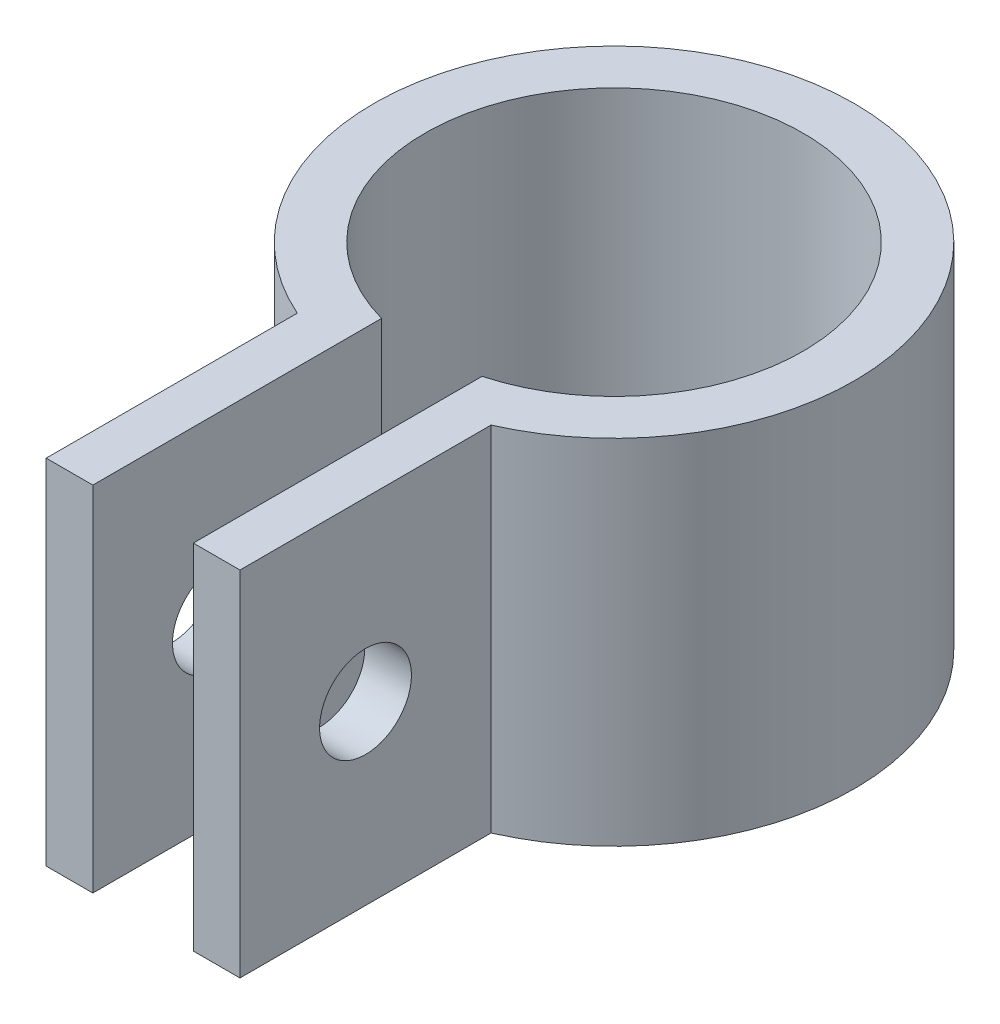
ISO-10303-21;
HEADER;
FILE_DESCRIPTION(('STEP AP214'),'2;1');
FILE_NAME('part.step','',(''),(''),'','','');
FILE_SCHEMA(('AUTOMOTIVE_DESIGN { 1 0 10303 214 1 1 1 1 }'));
ENDSEC;
DATA;
#1=APPLICATION_CONTEXT('core data for automotive mechanical design processes');
#2=APPLICATION_PROTOCOL_DEFINITION('international standard','automotive_design',2000,#1);
#3=PRODUCT_CONTEXT('',#1,'mechanical');
#4=PRODUCT('Part','Part','',(#3));
#5=PRODUCT_RELATED_PRODUCT_CATEGORY('part','',(#4));
#6=PRODUCT_DEFINITION_FORMATION('','',#4);
#7=PRODUCT_DEFINITION_CONTEXT('part definition',#1,'design');
#8=PRODUCT_DEFINITION('design','',#6,#7);
#9=PRODUCT_DEFINITION_SHAPE('','',#8);
#10=(LENGTH_UNIT() NAMED_UNIT(*) SI_UNIT(.MILLI.,.METRE.));
#11=(NAMED_UNIT(*) PLANE_ANGLE_UNIT() SI_UNIT($,.RADIAN.));
#12=(NAMED_UNIT(*) SI_UNIT($,.STERADIAN.) SOLID_ANGLE_UNIT());
#13=UNCERTAINTY_MEASURE_WITH_UNIT(LENGTH_MEASURE(1.E-05),#10,'distance_accuracy_value','');
#14=(GEOMETRIC_REPRESENTATION_CONTEXT(3) GLOBAL_UNCERTAINTY_ASSIGNED_CONTEXT((#13)) GLOBAL_UNIT_ASSIGNED_CONTEXT((#10,
#11,#12)) REPRESENTATION_CONTEXT('',''));
#15=CARTESIAN_POINT('',(0.,0.,0.));
#16=DIRECTION('',(0.,0.,1.));
#17=DIRECTION('',(1.,0.,0.));
#18=AXIS2_PLACEMENT_3D('',#15,#16,#17);
#19=CARTESIAN_POINT('',(0.,10.,0.));
#20=DIRECTION('',(0.,1.,0.));
#21=DIRECTION('',(0.,0.,1.));
#22=AXIS2_PLACEMENT_3D('',#19,#20,#21);
#23=PLANE('',#22);
#24=CARTESIAN_POINT('',(0.,10.,0.));
#25=DIRECTION('',(0.,1.,0.));
#26=DIRECTION('',(0.,0.,1.));
#27=AXIS2_PLACEMENT_3D('',#24,#25,#26);
#28=CIRCLE('',#27,5.35);
#29=CARTESIAN_POINT('',(1.42201100885586,10.,5.15755607731925));
#30=VERTEX_POINT('',#29);
#31=CARTESIAN_POINT('',(-1.42201100885586,10.,5.15755607731925));
#32=VERTEX_POINT('',#31);
#33=EDGE_CURVE('E115',#30,#32,#28,.T.);
#34=ORIENTED_EDGE('',*,*,#33,.F.);
#35=DIRECTION('',(0.,0.,-1.));
#36=VECTOR('',#35,1.);
#37=CARTESIAN_POINT('',(1.42201100885586,10.,22.114209441701));
#38=LINE('',#37,#36);
#39=CARTESIAN_POINT('',(1.42201100885586,10.,13.3292135527086));
#40=VERTEX_POINT('',#39);
#41=EDGE_CURVE('E50',#40,#30,#38,.T.);
#42=ORIENTED_EDGE('',*,*,#41,.F.);
#43=DIRECTION('',(1.,0.,0.));
#44=VECTOR('',#43,1.);
#45=CARTESIAN_POINT('',(2.74228688903122,10.,13.3292135527086));
#46=LINE('',#45,#44);
#47=CARTESIAN_POINT('',(2.74228688903122,10.,13.3292135527086));
#48=VERTEX_POINT('',#47);
#49=EDGE_CURVE('E114',#40,#48,#46,.T.);
#50=ORIENTED_EDGE('',*,*,#49,.T.);
#51=DIRECTION('',(0.,0.,-1.));
#52=VECTOR('',#51,1.);
#53=CARTESIAN_POINT('',(2.74228688903122,10.,-0.0450481591371954));
#54=LINE('',#53,#52);
#55=CARTESIAN_POINT('',(2.74228688903122,10.,6.22252863538991));
#56=VERTEX_POINT('',#55);
#57=EDGE_CURVE('E135',#48,#56,#54,.T.);
#58=ORIENTED_EDGE('',*,*,#57,.T.);
#59=CARTESIAN_POINT('',(0.,10.,0.));
#60=DIRECTION('',(0.,1.,0.));
#61=DIRECTION('',(0.,0.,1.));
#62=AXIS2_PLACEMENT_3D('',#59,#60,#61);
#63=CIRCLE('',#62,6.8);
#64=CARTESIAN_POINT('',(-2.74228688903122,10.,6.22252863538991));
#65=VERTEX_POINT('',#64);
#66=EDGE_CURVE('E145',#56,#65,#63,.T.);
#67=ORIENTED_EDGE('',*,*,#66,.T.);
#68=DIRECTION('',(0.,0.,1.));
#69=VECTOR('',#68,1.);
#70=CARTESIAN_POINT('',(-2.74228688903122,10.,-0.0450481591371954));
#71=LINE('',#70,#69);
#72=CARTESIAN_POINT('',(-2.74228688903122,10.,13.3292135527086));
#73=VERTEX_POINT('',#72);
#74=EDGE_CURVE('E131',#65,#73,#71,.T.);
#75=ORIENTED_EDGE('',*,*,#74,.T.);
#76=CARTESIAN_POINT('',(-1.42201100885586,10.,13.3292135527086));
#77=VERTEX_POINT('',#76);
#78=EDGE_CURVE('E159',#73,#77,#46,.T.);
#79=ORIENTED_EDGE('',*,*,#78,.T.);
#80=DIRECTION('',(0.,0.,1.));
#81=VECTOR('',#80,1.);
#82=CARTESIAN_POINT('',(-1.42201100885586,10.,22.114209441701));
#83=LINE('',#82,#81);
#84=EDGE_CURVE('E151',#32,#77,#83,.T.);
#85=ORIENTED_EDGE('',*,*,#84,.F.);
#86=EDGE_LOOP('',(#34,#42,#50,#58,#67,#75,#79,#85));
#87=FACE_BOUND('',#86,.T.);
#88=ADVANCED_FACE('F35',(#87),#23,.T.);
#89=CARTESIAN_POINT('',(0.,0.,0.));
#90=DIRECTION('',(0.,1.,0.));
#91=DIRECTION('',(0.,0.,1.));
#92=AXIS2_PLACEMENT_3D('',#89,#90,#91);
#93=PLANE('',#92);
#94=DIRECTION('',(0.,0.,-1.));
#95=VECTOR('',#94,1.);
#96=CARTESIAN_POINT('',(1.42201100885586,0.,22.114209441701));
#97=LINE('',#96,#95);
#98=CARTESIAN_POINT('',(1.42201100885586,0.,13.3292135527086));
#99=VERTEX_POINT('',#98);
#100=CARTESIAN_POINT('',(1.42201100885586,0.,5.15755607731925));
#101=VERTEX_POINT('',#100);
#102=EDGE_CURVE('E98',#99,#101,#97,.T.);
#103=ORIENTED_EDGE('',*,*,#102,.T.);
#104=CARTESIAN_POINT('',(0.,0.,0.));
#105=DIRECTION('',(0.,1.,0.));
#106=DIRECTION('',(0.,0.,1.));
#107=AXIS2_PLACEMENT_3D('',#104,#105,#106);
#108=CIRCLE('',#107,5.35);
#109=CARTESIAN_POINT('',(-1.42201100885586,0.,5.15755607731925));
#110=VERTEX_POINT('',#109);
#111=EDGE_CURVE('E126',#101,#110,#108,.T.);
#112=ORIENTED_EDGE('',*,*,#111,.T.);
#113=DIRECTION('',(0.,0.,1.));
#114=VECTOR('',#113,1.);
#115=CARTESIAN_POINT('',(-1.42201100885586,0.,22.114209441701));
#116=LINE('',#115,#114);
#117=CARTESIAN_POINT('',(-1.42201100885586,0.,13.3292135527086));
#118=VERTEX_POINT('',#117);
#119=EDGE_CURVE('E58',#110,#118,#116,.T.);
#120=ORIENTED_EDGE('',*,*,#119,.T.);
#121=DIRECTION('',(1.,0.,0.));
#122=VECTOR('',#121,1.);
#123=CARTESIAN_POINT('',(2.74228688903122,0.,13.3292135527086));
#124=LINE('',#123,#122);
#125=CARTESIAN_POINT('',(-2.74228688903122,0.,13.3292135527086));
#126=VERTEX_POINT('',#125);
#127=EDGE_CURVE('E122',#126,#118,#124,.T.);
#128=ORIENTED_EDGE('',*,*,#127,.F.);
#129=DIRECTION('',(0.,0.,1.));
#130=VECTOR('',#129,1.);
#131=CARTESIAN_POINT('',(-2.74228688903122,0.,-0.0450481591371954));
#132=LINE('',#131,#130);
#133=CARTESIAN_POINT('',(-2.74228688903122,0.,6.22252863538991));
#134=VERTEX_POINT('',#133);
#135=EDGE_CURVE('E123',#134,#126,#132,.T.);
#136=ORIENTED_EDGE('',*,*,#135,.F.);
#137=CARTESIAN_POINT('',(0.,0.,0.));
#138=DIRECTION('',(0.,1.,0.));
#139=DIRECTION('',(0.,0.,1.));
#140=AXIS2_PLACEMENT_3D('',#137,#138,#139);
#141=CIRCLE('',#140,6.8);
#142=CARTESIAN_POINT('',(2.74228688903122,0.,6.22252863538991));
#143=VERTEX_POINT('',#142);
#144=EDGE_CURVE('E144',#143,#134,#141,.T.);
#145=ORIENTED_EDGE('',*,*,#144,.F.);
#146=DIRECTION('',(0.,0.,-1.));
#147=VECTOR('',#146,1.);
#148=CARTESIAN_POINT('',(2.74228688903122,0.,-0.0450481591371954));
#149=LINE('',#148,#147);
#150=CARTESIAN_POINT('',(2.74228688903122,0.,13.3292135527086));
#151=VERTEX_POINT('',#150);
#152=EDGE_CURVE('E121',#151,#143,#149,.T.);
#153=ORIENTED_EDGE('',*,*,#152,.F.);
#154=EDGE_CURVE('E112',#99,#151,#124,.T.);
#155=ORIENTED_EDGE('',*,*,#154,.F.);
#156=EDGE_LOOP('',(#103,#112,#120,#128,#136,#145,#153,#155));
#157=FACE_BOUND('',#156,.T.);
#158=ADVANCED_FACE('F119',(#157),#93,.F.);
#159=CARTESIAN_POINT('',(2.74228688903122,10.,13.3292135527086));
#160=DIRECTION('',(0.,0.,-1.));
#161=DIRECTION('',(-1.,0.,0.));
#162=AXIS2_PLACEMENT_3D('',#159,#160,#161);
#163=PLANE('',#162);
#164=DIRECTION('',(0.,1.,0.));
#165=VECTOR('',#164,1.);
#166=CARTESIAN_POINT('',(1.42201100885586,10.,13.3292135527086));
#167=LINE('',#166,#165);
#168=EDGE_CURVE('E101',#99,#40,#167,.T.);
#169=ORIENTED_EDGE('',*,*,#168,.F.);
#170=ORIENTED_EDGE('',*,*,#154,.T.);
#171=DIRECTION('',(0.,-1.,0.));
#172=VECTOR('',#171,1.);
#173=CARTESIAN_POINT('',(2.74228688903122,10.,13.3292135527086));
#174=LINE('',#173,#172);
#175=EDGE_CURVE('E132',#48,#151,#174,.T.);
#176=ORIENTED_EDGE('',*,*,#175,.F.);
#177=ORIENTED_EDGE('',*,*,#49,.F.);
#178=EDGE_LOOP('',(#169,#170,#176,#177));
#179=FACE_BOUND('',#178,.T.);
#180=ADVANCED_FACE('F110',(#179),#163,.F.);
#181=DIRECTION('',(0.,-1.,0.));
#182=VECTOR('',#181,1.);
#183=CARTESIAN_POINT('',(-1.42201100885586,10.,13.3292135527086));
#184=LINE('',#183,#182);
#185=EDGE_CURVE('E116',#77,#118,#184,.T.);
#186=ORIENTED_EDGE('',*,*,#185,.F.);
#187=ORIENTED_EDGE('',*,*,#78,.F.);
#188=DIRECTION('',(0.,-1.,0.));
#189=VECTOR('',#188,1.);
#190=CARTESIAN_POINT('',(-2.74228688903122,10.,13.3292135527086));
#191=LINE('',#190,#189);
#192=EDGE_CURVE('E134',#73,#126,#191,.T.);
#193=ORIENTED_EDGE('',*,*,#192,.T.);
#194=ORIENTED_EDGE('',*,*,#127,.T.);
#195=EDGE_LOOP('',(#186,#187,#193,#194));
#196=FACE_BOUND('',#195,.T.);
#197=ADVANCED_FACE('F179',(#196),#163,.F.);
#198=CARTESIAN_POINT('',(0.,0.,0.));
#199=DIRECTION('',(0.,1.,0.));
#200=DIRECTION('',(0.,0.,1.));
#201=AXIS2_PLACEMENT_3D('',#198,#199,#200);
#202=CYLINDRICAL_SURFACE('',#201,5.35);
#203=DIRECTION('',(0.,1.,0.));
#204=VECTOR('',#203,1.);
#205=CARTESIAN_POINT('',(1.42201100885586,0.,5.15755607731925));
#206=LINE('',#205,#204);
#207=EDGE_CURVE('E11',#30,#101,#206,.F.);
#208=ORIENTED_EDGE('',*,*,#207,.F.);
#209=ORIENTED_EDGE('',*,*,#33,.T.);
#210=DIRECTION('',(0.,1.,0.));
#211=VECTOR('',#210,1.);
#212=CARTESIAN_POINT('',(-1.42201100885586,0.,5.15755607731925));
#213=LINE('',#212,#211);
#214=EDGE_CURVE('E44',#110,#32,#213,.T.);
#215=ORIENTED_EDGE('',*,*,#214,.F.);
#216=ORIENTED_EDGE('',*,*,#111,.F.);
#217=EDGE_LOOP('',(#208,#209,#215,#216));
#218=FACE_BOUND('',#217,.T.);
#219=ADVANCED_FACE('F161',(#218),#202,.F.);
#220=CARTESIAN_POINT('',(0.,10.,0.));
#221=DIRECTION('',(0.,-1.,0.));
#222=DIRECTION('',(0.,0.,-1.));
#223=AXIS2_PLACEMENT_3D('',#220,#221,#222);
#224=CYLINDRICAL_SURFACE('',#223,6.8);
#225=DIRECTION('',(0.,-1.,0.));
#226=VECTOR('',#225,1.);
#227=CARTESIAN_POINT('',(-2.74228688903122,10.,6.22252863538991));
#228=LINE('',#227,#226);
#229=EDGE_CURVE('E141',#65,#134,#228,.T.);
#230=ORIENTED_EDGE('',*,*,#229,.F.);
#231=ORIENTED_EDGE('',*,*,#66,.F.);
#232=DIRECTION('',(0.,-1.,0.));
#233=VECTOR('',#232,1.);
#234=CARTESIAN_POINT('',(2.74228688903122,10.,6.22252863538991));
#235=LINE('',#234,#233);
#236=EDGE_CURVE('E138',#143,#56,#235,.F.);
#237=ORIENTED_EDGE('',*,*,#236,.F.);
#238=ORIENTED_EDGE('',*,*,#144,.T.);
#239=EDGE_LOOP('',(#230,#231,#237,#238));
#240=FACE_BOUND('',#239,.T.);
#241=ADVANCED_FACE('F37',(#240),#224,.T.);
#242=CARTESIAN_POINT('',(-2.74228688903122,10.,-0.0450481591371954));
#243=DIRECTION('',(1.,0.,0.));
#244=DIRECTION('',(0.,0.,-1.));
#245=AXIS2_PLACEMENT_3D('',#242,#243,#244);
#246=PLANE('',#245);
#247=CARTESIAN_POINT('',(-2.74228688903122,5.,9.77587109404923));
#248=DIRECTION('',(1.,0.,0.));
#249=DIRECTION('',(0.,0.,-1.));
#250=AXIS2_PLACEMENT_3D('',#247,#248,#249);
#251=CIRCLE('',#250,1.3);
#252=CARTESIAN_POINT('',(-2.74228688903122,5.,8.47587109404923));
#253=VERTEX_POINT('',#252);
#254=EDGE_CURVE('E106',#253,#253,#251,.T.);
#255=ORIENTED_EDGE('',*,*,#254,.T.);
#256=EDGE_LOOP('',(#255));
#257=FACE_BOUND('',#256,.T.);
#258=ORIENTED_EDGE('',*,*,#74,.F.);
#259=ORIENTED_EDGE('',*,*,#229,.T.);
#260=ORIENTED_EDGE('',*,*,#135,.T.);
#261=ORIENTED_EDGE('',*,*,#192,.F.);
#262=EDGE_LOOP('',(#258,#259,#260,#261));
#263=FACE_BOUND('',#262,.T.);
#264=ADVANCED_FACE('F175',(#257,#263),#246,.F.);
#265=CARTESIAN_POINT('',(2.74228688903122,10.,-0.0450481591371954));
#266=DIRECTION('',(-1.,0.,0.));
#267=DIRECTION('',(0.,0.,1.));
#268=AXIS2_PLACEMENT_3D('',#265,#266,#267);
#269=PLANE('',#268);
#270=CARTESIAN_POINT('',(2.74228688903122,5.,9.77587109404923));
#271=DIRECTION('',(1.,0.,0.));
#272=DIRECTION('',(0.,0.,-1.));
#273=AXIS2_PLACEMENT_3D('',#270,#271,#272);
#274=CIRCLE('',#273,1.3);
#275=CARTESIAN_POINT('',(2.74228688903122,5.,8.47587109404923));
#276=VERTEX_POINT('',#275);
#277=EDGE_CURVE('E189',#276,#276,#274,.T.);
#278=ORIENTED_EDGE('',*,*,#277,.F.);
#279=EDGE_LOOP('',(#278));
#280=FACE_BOUND('',#279,.T.);
#281=ORIENTED_EDGE('',*,*,#152,.T.);
#282=ORIENTED_EDGE('',*,*,#236,.T.);
#283=ORIENTED_EDGE('',*,*,#57,.F.);
#284=ORIENTED_EDGE('',*,*,#175,.T.);
#285=EDGE_LOOP('',(#281,#282,#283,#284));
#286=FACE_BOUND('',#285,.T.);
#287=ADVANCED_FACE('F170',(#280,#286),#269,.F.);
#288=CARTESIAN_POINT('',(-1.42201100885586,10.,22.114209441701));
#289=DIRECTION('',(1.,0.,0.));
#290=DIRECTION('',(0.,0.,-1.));
#291=AXIS2_PLACEMENT_3D('',#288,#289,#290);
#292=PLANE('',#291);
#293=CARTESIAN_POINT('',(-1.42201100885586,5.,9.77587109404923));
#294=DIRECTION('',(1.,0.,0.));
#295=DIRECTION('',(0.,0.,-1.));
#296=AXIS2_PLACEMENT_3D('',#293,#294,#295);
#297=CIRCLE('',#296,1.3);
#298=CARTESIAN_POINT('',(-1.42201100885586,5.,8.47587109404923));
#299=VERTEX_POINT('',#298);
#300=EDGE_CURVE('E186',#299,#299,#297,.T.);
#301=ORIENTED_EDGE('',*,*,#300,.F.);
#302=EDGE_LOOP('',(#301));
#303=FACE_BOUND('',#302,.T.);
#304=ORIENTED_EDGE('',*,*,#185,.T.);
#305=ORIENTED_EDGE('',*,*,#119,.F.);
#306=ORIENTED_EDGE('',*,*,#214,.T.);
#307=ORIENTED_EDGE('',*,*,#84,.T.);
#308=EDGE_LOOP('',(#304,#305,#306,#307));
#309=FACE_BOUND('',#308,.T.);
#310=ADVANCED_FACE('F150',(#303,#309),#292,.T.);
#311=CARTESIAN_POINT('',(1.42201100885586,10.,22.114209441701));
#312=DIRECTION('',(-1.,0.,0.));
#313=DIRECTION('',(0.,0.,1.));
#314=AXIS2_PLACEMENT_3D('',#311,#312,#313);
#315=PLANE('',#314);
#316=CARTESIAN_POINT('',(1.42201100885586,5.,9.77587109404923));
#317=DIRECTION('',(-1.,0.,0.));
#318=DIRECTION('',(0.,0.,1.));
#319=AXIS2_PLACEMENT_3D('',#316,#317,#318);
#320=CIRCLE('',#319,1.3);
#321=CARTESIAN_POINT('',(1.42201100885586,5.,11.0758710940492));
#322=VERTEX_POINT('',#321);
#323=EDGE_CURVE('E39',#322,#322,#320,.T.);
#324=ORIENTED_EDGE('',*,*,#323,.F.);
#325=EDGE_LOOP('',(#324));
#326=FACE_BOUND('',#325,.T.);
#327=ORIENTED_EDGE('',*,*,#168,.T.);
#328=ORIENTED_EDGE('',*,*,#41,.T.);
#329=ORIENTED_EDGE('',*,*,#207,.T.);
#330=ORIENTED_EDGE('',*,*,#102,.F.);
#331=EDGE_LOOP('',(#327,#328,#329,#330));
#332=FACE_BOUND('',#331,.T.);
#333=ADVANCED_FACE('F100',(#326,#332),#315,.T.);
#334=CARTESIAN_POINT('',(-7.25771311096878,5.,9.77587109404923));
#335=DIRECTION('',(1.,0.,0.));
#336=DIRECTION('',(0.,0.,-1.));
#337=AXIS2_PLACEMENT_3D('',#334,#335,#336);
#338=CYLINDRICAL_SURFACE('',#337,1.3);
#339=ORIENTED_EDGE('',*,*,#323,.T.);
#340=EDGE_LOOP('',(#339));
#341=FACE_BOUND('',#340,.T.);
#342=ORIENTED_EDGE('',*,*,#277,.T.);
#343=EDGE_LOOP('',(#342));
#344=FACE_BOUND('',#343,.T.);
#345=ADVANCED_FACE('F196',(#341,#344),#338,.F.);
#346=ORIENTED_EDGE('',*,*,#300,.T.);
#347=EDGE_LOOP('',(#346));
#348=FACE_BOUND('',#347,.T.);
#349=ORIENTED_EDGE('',*,*,#254,.F.);
#350=EDGE_LOOP('',(#349));
#351=FACE_BOUND('',#350,.T.);
#352=ADVANCED_FACE('F204',(#348,#351),#338,.F.);
#353=CLOSED_SHELL('',(#88,#158,#180,#197,#219,#241,#264,#287,#310,#333,#345,#352));
#354=MANIFOLD_SOLID_BREP('B2',#353);
#355=ADVANCED_BREP_SHAPE_REPRESENTATION('',(#18,#354),#14);
#356=SHAPE_DEFINITION_REPRESENTATION(#9,#355);
ENDSEC;
END-ISO-10303-21;
